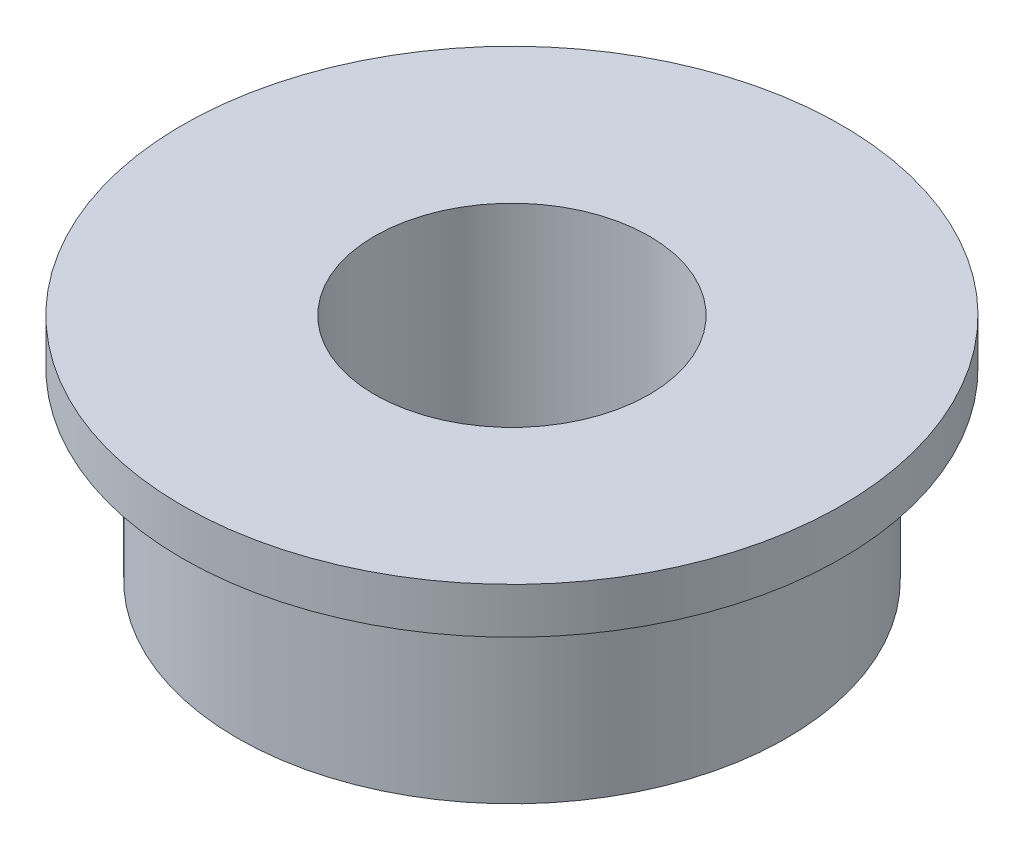
ISO-10303-21;
HEADER;
FILE_DESCRIPTION(('STEP AP214'),'2;1');
FILE_NAME('part.step','',(''),(''),'','','');
FILE_SCHEMA(('AUTOMOTIVE_DESIGN { 1 0 10303 214 1 1 1 1 }'));
ENDSEC;
DATA;
#1=APPLICATION_CONTEXT('core data for automotive mechanical design processes');
#2=APPLICATION_PROTOCOL_DEFINITION('international standard','automotive_design',2000,#1);
#3=PRODUCT_CONTEXT('',#1,'mechanical');
#4=PRODUCT('Part','Part','',(#3));
#5=PRODUCT_RELATED_PRODUCT_CATEGORY('part','',(#4));
#6=PRODUCT_DEFINITION_FORMATION('','',#4);
#7=PRODUCT_DEFINITION_CONTEXT('part definition',#1,'design');
#8=PRODUCT_DEFINITION('design','',#6,#7);
#9=PRODUCT_DEFINITION_SHAPE('','',#8);
#10=(LENGTH_UNIT() NAMED_UNIT(*) SI_UNIT(.MILLI.,.METRE.));
#11=(NAMED_UNIT(*) PLANE_ANGLE_UNIT() SI_UNIT($,.RADIAN.));
#12=(NAMED_UNIT(*) SI_UNIT($,.STERADIAN.) SOLID_ANGLE_UNIT());
#13=UNCERTAINTY_MEASURE_WITH_UNIT(LENGTH_MEASURE(1.E-05),#10,'distance_accuracy_value','');
#14=(GEOMETRIC_REPRESENTATION_CONTEXT(3) GLOBAL_UNCERTAINTY_ASSIGNED_CONTEXT((#13)) GLOBAL_UNIT_ASSIGNED_CONTEXT((#10,
#11,#12)) REPRESENTATION_CONTEXT('',''));
#15=CARTESIAN_POINT('',(0.,0.,0.));
#16=DIRECTION('',(0.,0.,1.));
#17=DIRECTION('',(1.,0.,0.));
#18=AXIS2_PLACEMENT_3D('',#15,#16,#17);
#19=CARTESIAN_POINT('',(0.,0.,0.));
#20=DIRECTION('',(0.,1.,0.));
#21=DIRECTION('',(0.,0.,1.));
#22=AXIS2_PLACEMENT_3D('',#19,#20,#21);
#23=PLANE('',#22);
#24=CARTESIAN_POINT('',(0.,0.,0.));
#25=DIRECTION('',(0.,1.,0.));
#26=DIRECTION('',(0.,0.,1.));
#27=AXIS2_PLACEMENT_3D('',#24,#25,#26);
#28=CIRCLE('',#27,3.);
#29=CARTESIAN_POINT('',(0.,0.,3.));
#30=VERTEX_POINT('',#29);
#31=EDGE_CURVE('E38',#30,#30,#28,.T.);
#32=ORIENTED_EDGE('',*,*,#31,.F.);
#33=EDGE_LOOP('',(#32));
#34=FACE_BOUND('',#33,.T.);
#35=CARTESIAN_POINT('',(0.,0.,0.));
#36=DIRECTION('',(0.,1.,0.));
#37=DIRECTION('',(0.,0.,1.));
#38=AXIS2_PLACEMENT_3D('',#35,#36,#37);
#39=CIRCLE('',#38,1.5);
#40=CARTESIAN_POINT('',(0.,0.,1.5));
#41=VERTEX_POINT('',#40);
#42=EDGE_CURVE('E45',#41,#41,#39,.T.);
#43=ORIENTED_EDGE('',*,*,#42,.T.);
#44=EDGE_LOOP('',(#43));
#45=FACE_BOUND('',#44,.T.);
#46=ADVANCED_FACE('F34',(#34,#45),#23,.F.);
#47=CARTESIAN_POINT('',(0.,2.,0.));
#48=DIRECTION('',(0.,-1.,0.));
#49=DIRECTION('',(0.,0.,-1.));
#50=AXIS2_PLACEMENT_3D('',#47,#48,#49);
#51=CYLINDRICAL_SURFACE('',#50,3.);
#52=CARTESIAN_POINT('',(0.,2.,0.));
#53=DIRECTION('',(0.,1.,0.));
#54=DIRECTION('',(0.,0.,1.));
#55=AXIS2_PLACEMENT_3D('',#52,#53,#54);
#56=CIRCLE('',#55,3.);
#57=CARTESIAN_POINT('',(0.,2.,3.));
#58=VERTEX_POINT('',#57);
#59=EDGE_CURVE('E10',#58,#58,#56,.T.);
#60=ORIENTED_EDGE('',*,*,#59,.F.);
#61=EDGE_LOOP('',(#60));
#62=FACE_BOUND('',#61,.T.);
#63=ORIENTED_EDGE('',*,*,#31,.T.);
#64=EDGE_LOOP('',(#63));
#65=FACE_BOUND('',#64,.T.);
#66=ADVANCED_FACE('F36',(#62,#65),#51,.T.);
#67=CARTESIAN_POINT('',(0.,2.,0.));
#68=DIRECTION('',(0.,-1.,0.));
#69=DIRECTION('',(0.,0.,-1.));
#70=AXIS2_PLACEMENT_3D('',#67,#68,#69);
#71=CYLINDRICAL_SURFACE('',#70,1.5);
#72=ORIENTED_EDGE('',*,*,#42,.F.);
#73=EDGE_LOOP('',(#72));
#74=FACE_BOUND('',#73,.T.);
#75=CARTESIAN_POINT('',(0.,2.5,0.));
#76=DIRECTION('',(0.,1.,0.));
#77=DIRECTION('',(0.,0.,1.));
#78=AXIS2_PLACEMENT_3D('',#75,#76,#77);
#79=CIRCLE('',#78,1.5);
#80=CARTESIAN_POINT('',(0.,2.5,1.5));
#81=VERTEX_POINT('',#80);
#82=EDGE_CURVE('E53',#81,#81,#79,.T.);
#83=ORIENTED_EDGE('',*,*,#82,.T.);
#84=EDGE_LOOP('',(#83));
#85=FACE_BOUND('',#84,.T.);
#86=ADVANCED_FACE('F59',(#74,#85),#71,.F.);
#87=CARTESIAN_POINT('',(0.,2.5,0.));
#88=DIRECTION('',(0.,1.,0.));
#89=DIRECTION('',(0.,0.,1.));
#90=AXIS2_PLACEMENT_3D('',#87,#88,#89);
#91=PLANE('',#90);
#92=CARTESIAN_POINT('',(0.,2.5,0.));
#93=DIRECTION('',(0.,1.,0.));
#94=DIRECTION('',(0.,0.,1.));
#95=AXIS2_PLACEMENT_3D('',#92,#93,#94);
#96=CIRCLE('',#95,3.6);
#97=CARTESIAN_POINT('',(0.,2.5,3.6));
#98=VERTEX_POINT('',#97);
#99=EDGE_CURVE('E49',#98,#98,#96,.T.);
#100=ORIENTED_EDGE('',*,*,#99,.T.);
#101=EDGE_LOOP('',(#100));
#102=FACE_BOUND('',#101,.T.);
#103=ORIENTED_EDGE('',*,*,#82,.F.);
#104=EDGE_LOOP('',(#103));
#105=FACE_BOUND('',#104,.T.);
#106=ADVANCED_FACE('F61',(#102,#105),#91,.T.);
#107=CARTESIAN_POINT('',(0.,2.,0.));
#108=DIRECTION('',(0.,1.,0.));
#109=DIRECTION('',(0.,0.,1.));
#110=AXIS2_PLACEMENT_3D('',#107,#108,#109);
#111=PLANE('',#110);
#112=ORIENTED_EDGE('',*,*,#59,.T.);
#113=EDGE_LOOP('',(#112));
#114=FACE_BOUND('',#113,.T.);
#115=CARTESIAN_POINT('',(0.,2.,0.));
#116=DIRECTION('',(0.,1.,0.));
#117=DIRECTION('',(0.,0.,1.));
#118=AXIS2_PLACEMENT_3D('',#115,#116,#117);
#119=CIRCLE('',#118,3.6);
#120=CARTESIAN_POINT('',(0.,2.,3.6));
#121=VERTEX_POINT('',#120);
#122=EDGE_CURVE('E50',#121,#121,#119,.T.);
#123=ORIENTED_EDGE('',*,*,#122,.F.);
#124=EDGE_LOOP('',(#123));
#125=FACE_BOUND('',#124,.T.);
#126=ADVANCED_FACE('F63',(#114,#125),#111,.F.);
#127=CARTESIAN_POINT('',(0.,2.5,0.));
#128=DIRECTION('',(0.,-1.,0.));
#129=DIRECTION('',(0.,0.,-1.));
#130=AXIS2_PLACEMENT_3D('',#127,#128,#129);
#131=CYLINDRICAL_SURFACE('',#130,3.6);
#132=ORIENTED_EDGE('',*,*,#99,.F.);
#133=EDGE_LOOP('',(#132));
#134=FACE_BOUND('',#133,.T.);
#135=ORIENTED_EDGE('',*,*,#122,.T.);
#136=EDGE_LOOP('',(#135));
#137=FACE_BOUND('',#136,.T.);
#138=ADVANCED_FACE('F70',(#134,#137),#131,.T.);
#139=CLOSED_SHELL('',(#46,#66,#86,#106,#126,#138));
#140=MANIFOLD_SOLID_BREP('B2',#139);
#141=ADVANCED_BREP_SHAPE_REPRESENTATION('',(#18,#140),#14);
#142=SHAPE_DEFINITION_REPRESENTATION(#9,#141);
ENDSEC;
END-ISO-10303-21;
